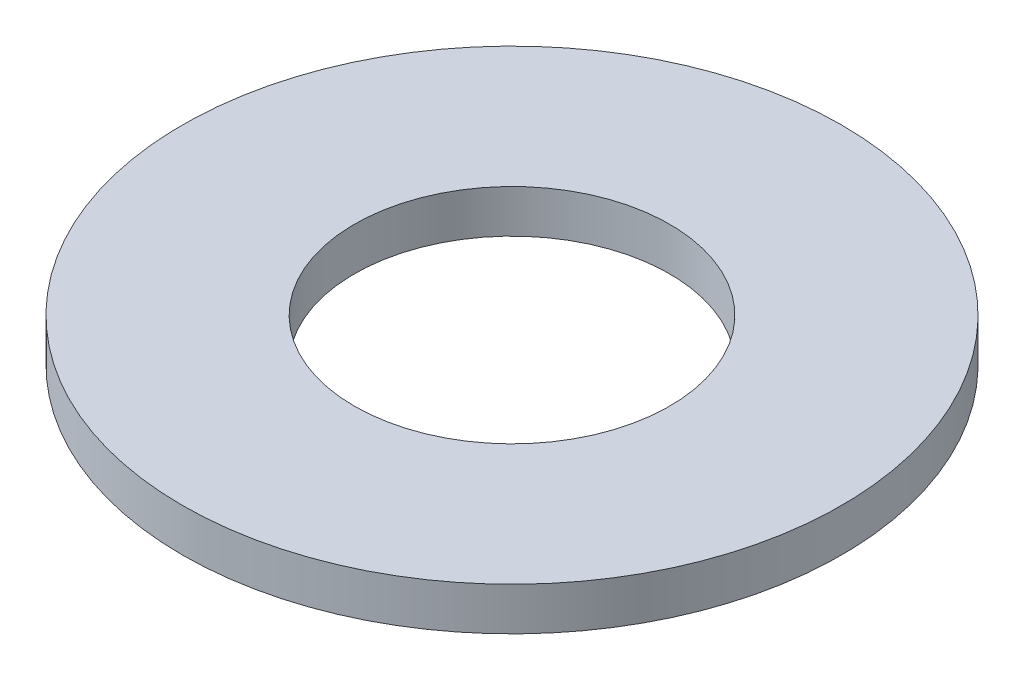
ISO-10303-21;
HEADER;
FILE_DESCRIPTION(('STEP AP214'),'2;1');
FILE_NAME('part.step','',(''),(''),'','','');
FILE_SCHEMA(('AUTOMOTIVE_DESIGN { 1 0 10303 214 1 1 1 1 }'));
ENDSEC;
DATA;
#1=APPLICATION_CONTEXT('core data for automotive mechanical design processes');
#2=APPLICATION_PROTOCOL_DEFINITION('international standard','automotive_design',2000,#1);
#3=PRODUCT_CONTEXT('',#1,'mechanical');
#4=PRODUCT('Part','Part','',(#3));
#5=PRODUCT_RELATED_PRODUCT_CATEGORY('part','',(#4));
#6=PRODUCT_DEFINITION_FORMATION('','',#4);
#7=PRODUCT_DEFINITION_CONTEXT('part definition',#1,'design');
#8=PRODUCT_DEFINITION('design','',#6,#7);
#9=PRODUCT_DEFINITION_SHAPE('','',#8);
#10=(LENGTH_UNIT() NAMED_UNIT(*) SI_UNIT(.MILLI.,.METRE.));
#11=(NAMED_UNIT(*) PLANE_ANGLE_UNIT() SI_UNIT($,.RADIAN.));
#12=(NAMED_UNIT(*) SI_UNIT($,.STERADIAN.) SOLID_ANGLE_UNIT());
#13=UNCERTAINTY_MEASURE_WITH_UNIT(LENGTH_MEASURE(1.E-05),#10,'distance_accuracy_value','');
#14=(GEOMETRIC_REPRESENTATION_CONTEXT(3) GLOBAL_UNCERTAINTY_ASSIGNED_CONTEXT((#13)) GLOBAL_UNIT_ASSIGNED_CONTEXT((#10,
#11,#12)) REPRESENTATION_CONTEXT('',''));
#15=CARTESIAN_POINT('',(0.,0.,0.));
#16=DIRECTION('',(0.,0.,1.));
#17=DIRECTION('',(1.,0.,0.));
#18=AXIS2_PLACEMENT_3D('',#15,#16,#17);
#19=CARTESIAN_POINT('',(0.,3.,0.));
#20=DIRECTION('',(0.,1.,0.));
#21=DIRECTION('',(0.,0.,1.));
#22=AXIS2_PLACEMENT_3D('',#19,#20,#21);
#23=PLANE('',#22);
#24=CARTESIAN_POINT('',(0.,3.,0.));
#25=DIRECTION('',(0.,1.,0.));
#26=DIRECTION('',(0.,0.,1.));
#27=AXIS2_PLACEMENT_3D('',#24,#25,#26);
#28=CIRCLE('',#27,23.);
#29=CARTESIAN_POINT('',(0.,3.,23.));
#30=VERTEX_POINT('',#29);
#31=EDGE_CURVE('E10',#30,#30,#28,.T.);
#32=ORIENTED_EDGE('',*,*,#31,.T.);
#33=EDGE_LOOP('',(#32));
#34=FACE_BOUND('',#33,.T.);
#35=CARTESIAN_POINT('',(0.,3.,0.));
#36=DIRECTION('',(0.,1.,0.));
#37=DIRECTION('',(0.,0.,1.));
#38=AXIS2_PLACEMENT_3D('',#35,#36,#37);
#39=CIRCLE('',#38,11.);
#40=CARTESIAN_POINT('',(0.,3.,11.));
#41=VERTEX_POINT('',#40);
#42=EDGE_CURVE('E56',#41,#41,#39,.T.);
#43=ORIENTED_EDGE('',*,*,#42,.F.);
#44=EDGE_LOOP('',(#43));
#45=FACE_BOUND('',#44,.T.);
#46=ADVANCED_FACE('F43',(#34,#45),#23,.T.);
#47=CARTESIAN_POINT('',(0.,0.,0.));
#48=DIRECTION('',(0.,1.,0.));
#49=DIRECTION('',(0.,0.,1.));
#50=AXIS2_PLACEMENT_3D('',#47,#48,#49);
#51=PLANE('',#50);
#52=CARTESIAN_POINT('',(0.,0.,0.));
#53=DIRECTION('',(0.,1.,0.));
#54=DIRECTION('',(0.,0.,1.));
#55=AXIS2_PLACEMENT_3D('',#52,#53,#54);
#56=CIRCLE('',#55,23.);
#57=CARTESIAN_POINT('',(0.,0.,23.));
#58=VERTEX_POINT('',#57);
#59=EDGE_CURVE('E47',#58,#58,#56,.T.);
#60=ORIENTED_EDGE('',*,*,#59,.F.);
#61=EDGE_LOOP('',(#60));
#62=FACE_BOUND('',#61,.T.);
#63=CARTESIAN_POINT('',(0.,0.,0.));
#64=DIRECTION('',(0.,1.,0.));
#65=DIRECTION('',(0.,0.,1.));
#66=AXIS2_PLACEMENT_3D('',#63,#64,#65);
#67=CIRCLE('',#66,11.);
#68=CARTESIAN_POINT('',(0.,0.,11.));
#69=VERTEX_POINT('',#68);
#70=EDGE_CURVE('E58',#69,#69,#67,.T.);
#71=ORIENTED_EDGE('',*,*,#70,.T.);
#72=EDGE_LOOP('',(#71));
#73=FACE_BOUND('',#72,.T.);
#74=ADVANCED_FACE('F70',(#62,#73),#51,.F.);
#75=CARTESIAN_POINT('',(0.,3.,0.));
#76=DIRECTION('',(0.,-1.,0.));
#77=DIRECTION('',(0.,0.,-1.));
#78=AXIS2_PLACEMENT_3D('',#75,#76,#77);
#79=CYLINDRICAL_SURFACE('',#78,23.);
#80=ORIENTED_EDGE('',*,*,#31,.F.);
#81=EDGE_LOOP('',(#80));
#82=FACE_BOUND('',#81,.T.);
#83=ORIENTED_EDGE('',*,*,#59,.T.);
#84=EDGE_LOOP('',(#83));
#85=FACE_BOUND('',#84,.T.);
#86=ADVANCED_FACE('F45',(#82,#85),#79,.T.);
#87=CARTESIAN_POINT('',(0.,3.,0.));
#88=DIRECTION('',(0.,-1.,0.));
#89=DIRECTION('',(0.,0.,-1.));
#90=AXIS2_PLACEMENT_3D('',#87,#88,#89);
#91=CYLINDRICAL_SURFACE('',#90,11.);
#92=ORIENTED_EDGE('',*,*,#42,.T.);
#93=EDGE_LOOP('',(#92));
#94=FACE_BOUND('',#93,.T.);
#95=ORIENTED_EDGE('',*,*,#70,.F.);
#96=EDGE_LOOP('',(#95));
#97=FACE_BOUND('',#96,.T.);
#98=ADVANCED_FACE('F66',(#94,#97),#91,.F.);
#99=CLOSED_SHELL('',(#46,#74,#86,#98));
#100=MANIFOLD_SOLID_BREP('B2',#99);
#101=ADVANCED_BREP_SHAPE_REPRESENTATION('',(#18,#100),#14);
#102=SHAPE_DEFINITION_REPRESENTATION(#9,#101);
ENDSEC;
END-ISO-10303-21;
